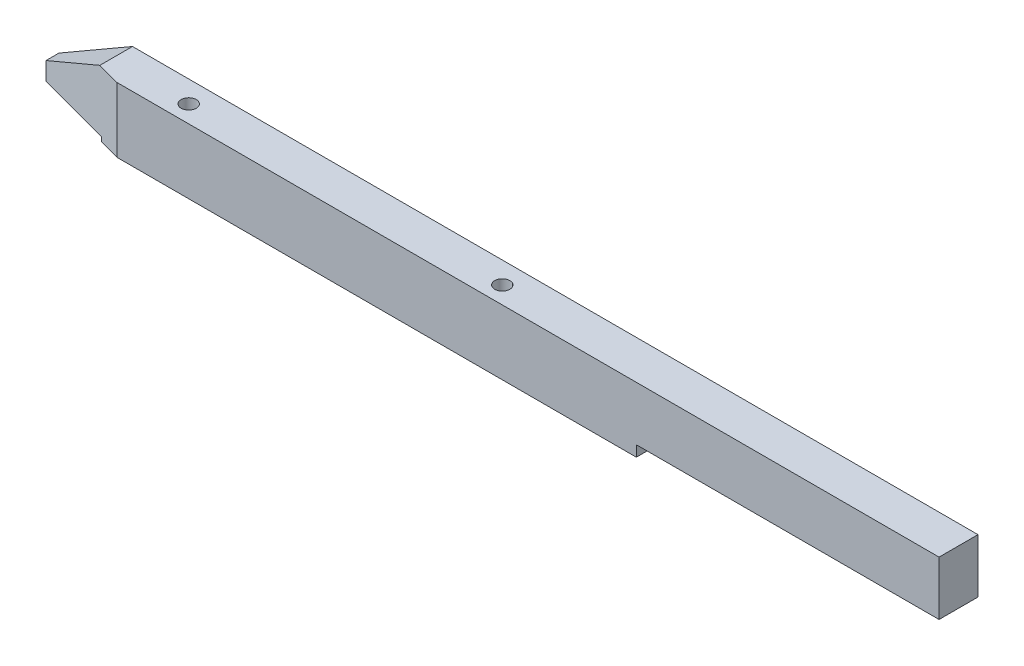
ISO-10303-21;
HEADER;
FILE_DESCRIPTION(('STEP AP214'),'2;1');
FILE_NAME('part.step','',(''),(''),'','','');
FILE_SCHEMA(('AUTOMOTIVE_DESIGN { 1 0 10303 214 1 1 1 1 }'));
ENDSEC;
DATA;
#1=APPLICATION_CONTEXT('core data for automotive mechanical design processes');
#2=APPLICATION_PROTOCOL_DEFINITION('international standard','automotive_design',2000,#1);
#3=PRODUCT_CONTEXT('',#1,'mechanical');
#4=PRODUCT('Part','Part','',(#3));
#5=PRODUCT_RELATED_PRODUCT_CATEGORY('part','',(#4));
#6=PRODUCT_DEFINITION_FORMATION('','',#4);
#7=PRODUCT_DEFINITION_CONTEXT('part definition',#1,'design');
#8=PRODUCT_DEFINITION('design','',#6,#7);
#9=PRODUCT_DEFINITION_SHAPE('','',#8);
#10=(LENGTH_UNIT() NAMED_UNIT(*) SI_UNIT(.MILLI.,.METRE.));
#11=(NAMED_UNIT(*) PLANE_ANGLE_UNIT() SI_UNIT($,.RADIAN.));
#12=(NAMED_UNIT(*) SI_UNIT($,.STERADIAN.) SOLID_ANGLE_UNIT());
#13=UNCERTAINTY_MEASURE_WITH_UNIT(LENGTH_MEASURE(1.E-05),#10,'distance_accuracy_value','');
#14=(GEOMETRIC_REPRESENTATION_CONTEXT(3) GLOBAL_UNCERTAINTY_ASSIGNED_CONTEXT((#13)) GLOBAL_UNIT_ASSIGNED_CONTEXT((#10,
#11,#12)) REPRESENTATION_CONTEXT('',''));
#15=CARTESIAN_POINT('',(0.,0.,0.));
#16=DIRECTION('',(0.,0.,1.));
#17=DIRECTION('',(1.,0.,0.));
#18=AXIS2_PLACEMENT_3D('',#15,#16,#17);
#19=CARTESIAN_POINT('',(212.5,15.,-9.));
#20=DIRECTION('',(0.,0.,1.));
#21=DIRECTION('',(0.,-1.,0.));
#22=AXIS2_PLACEMENT_3D('',#19,#20,#21);
#23=PLANE('',#22);
#24=DIRECTION('',(0.,1.,0.));
#25=VECTOR('',#24,1.);
#26=CARTESIAN_POINT('',(-212.5,15.,-9.));
#27=LINE('',#26,#25);
#28=CARTESIAN_POINT('',(-212.5,-13.,-9.));
#29=VERTEX_POINT('',#28);
#30=CARTESIAN_POINT('',(-212.5,-4.62990915244702,-9.));
#31=VERTEX_POINT('',#30);
#32=EDGE_CURVE('E123',#29,#31,#27,.T.);
#33=ORIENTED_EDGE('',*,*,#32,.T.);
#34=DIRECTION('',(0.866025403784442,0.499999999999995,0.));
#35=VECTOR('',#34,1.);
#36=CARTESIAN_POINT('',(-212.5,-4.62990915244702,-9.));
#37=LINE('',#36,#35);
#38=CARTESIAN_POINT('',(-178.5,15.,-9.));
#39=VERTEX_POINT('',#38);
#40=EDGE_CURVE('E111',#31,#39,#37,.T.);
#41=ORIENTED_EDGE('',*,*,#40,.T.);
#42=DIRECTION('',(-1.,0.,0.));
#43=VECTOR('',#42,1.);
#44=CARTESIAN_POINT('',(212.5,15.,-9.));
#45=LINE('',#44,#43);
#46=CARTESIAN_POINT('',(212.5,15.,-9.));
#47=VERTEX_POINT('',#46);
#48=EDGE_CURVE('E120',#47,#39,#45,.T.);
#49=ORIENTED_EDGE('',*,*,#48,.F.);
#50=DIRECTION('',(0.,1.,0.));
#51=VECTOR('',#50,1.);
#52=CARTESIAN_POINT('',(212.5,15.,-9.));
#53=LINE('',#52,#51);
#54=CARTESIAN_POINT('',(212.5,-10.,-9.));
#55=VERTEX_POINT('',#54);
#56=EDGE_CURVE('E179',#55,#47,#53,.T.);
#57=ORIENTED_EDGE('',*,*,#56,.F.);
#58=DIRECTION('',(-1.,0.,0.));
#59=VECTOR('',#58,1.);
#60=CARTESIAN_POINT('',(212.5,-10.,-9.));
#61=LINE('',#60,#59);
#62=CARTESIAN_POINT('',(72.5,-10.,-9.));
#63=VERTEX_POINT('',#62);
#64=EDGE_CURVE('E200',#55,#63,#61,.T.);
#65=ORIENTED_EDGE('',*,*,#64,.T.);
#66=DIRECTION('',(0.,-1.,0.));
#67=VECTOR('',#66,1.);
#68=CARTESIAN_POINT('',(72.5,-15.,-9.));
#69=LINE('',#68,#67);
#70=CARTESIAN_POINT('',(72.5,-15.,-9.));
#71=VERTEX_POINT('',#70);
#72=EDGE_CURVE('E203',#63,#71,#69,.T.);
#73=ORIENTED_EDGE('',*,*,#72,.T.);
#74=DIRECTION('',(-1.,0.,0.));
#75=VECTOR('',#74,1.);
#76=CARTESIAN_POINT('',(212.5,-15.,-9.));
#77=LINE('',#76,#75);
#78=CARTESIAN_POINT('',(-177.5,-15.,-9.));
#79=VERTEX_POINT('',#78);
#80=EDGE_CURVE('E175',#71,#79,#77,.T.);
#81=ORIENTED_EDGE('',*,*,#80,.T.);
#82=DIRECTION('',(0.,1.,0.));
#83=VECTOR('',#82,1.);
#84=CARTESIAN_POINT('',(-177.5,-13.,-9.));
#85=LINE('',#84,#83);
#86=CARTESIAN_POINT('',(-177.5,-13.,-9.));
#87=VERTEX_POINT('',#86);
#88=EDGE_CURVE('E191',#79,#87,#85,.T.);
#89=ORIENTED_EDGE('',*,*,#88,.T.);
#90=DIRECTION('',(-1.,0.,0.));
#91=VECTOR('',#90,1.);
#92=CARTESIAN_POINT('',(-212.5,-13.,-9.));
#93=LINE('',#92,#91);
#94=EDGE_CURVE('E193',#87,#29,#93,.T.);
#95=ORIENTED_EDGE('',*,*,#94,.T.);
#96=EDGE_LOOP('',(#33,#41,#49,#57,#65,#73,#81,#89,#95));
#97=FACE_BOUND('',#96,.T.);
#98=ADVANCED_FACE('F34',(#97),#23,.F.);
#99=CARTESIAN_POINT('',(212.5,15.,9.));
#100=DIRECTION('',(0.,-1.,0.));
#101=DIRECTION('',(0.,0.,-1.));
#102=AXIS2_PLACEMENT_3D('',#99,#100,#101);
#103=PLANE('',#102);
#104=CARTESIAN_POINT('',(-142.5,15.,1.));
#105=DIRECTION('',(0.,1.,0.));
#106=DIRECTION('',(0.,0.,1.));
#107=AXIS2_PLACEMENT_3D('',#104,#105,#106);
#108=CIRCLE('',#107,3.49999999999998);
#109=CARTESIAN_POINT('',(-142.5,15.,4.49999999999998));
#110=VERTEX_POINT('',#109);
#111=EDGE_CURVE('E210',#110,#110,#108,.T.);
#112=ORIENTED_EDGE('',*,*,#111,.F.);
#113=EDGE_LOOP('',(#112));
#114=FACE_BOUND('',#113,.T.);
#115=CARTESIAN_POINT('',(2.5,15.,1.));
#116=DIRECTION('',(0.,1.,0.));
#117=DIRECTION('',(0.,0.,1.));
#118=AXIS2_PLACEMENT_3D('',#115,#116,#117);
#119=CIRCLE('',#118,3.49999999999999);
#120=CARTESIAN_POINT('',(2.5,15.,4.49999999999999));
#121=VERTEX_POINT('',#120);
#122=EDGE_CURVE('E219',#121,#121,#119,.T.);
#123=ORIENTED_EDGE('',*,*,#122,.F.);
#124=EDGE_LOOP('',(#123));
#125=FACE_BOUND('',#124,.T.);
#126=ORIENTED_EDGE('',*,*,#48,.T.);
#127=DIRECTION('',(0.,0.,1.));
#128=VECTOR('',#127,1.);
#129=CARTESIAN_POINT('',(-178.5,15.,-9.));
#130=LINE('',#129,#128);
#131=CARTESIAN_POINT('',(-178.5,15.,6.11027254265818));
#132=VERTEX_POINT('',#131);
#133=EDGE_CURVE('E108',#39,#132,#130,.T.);
#134=ORIENTED_EDGE('',*,*,#133,.T.);
#135=DIRECTION('',(-0.965925826289068,0.,-0.258819045102522));
#136=VECTOR('',#135,1.);
#137=CARTESIAN_POINT('',(-167.715390309174,15.,9.));
#138=LINE('',#137,#136);
#139=CARTESIAN_POINT('',(-167.715390309174,15.,9.));
#140=VERTEX_POINT('',#139);
#141=EDGE_CURVE('E145',#132,#140,#138,.F.);
#142=ORIENTED_EDGE('',*,*,#141,.T.);
#143=DIRECTION('',(-1.,0.,0.));
#144=VECTOR('',#143,1.);
#145=CARTESIAN_POINT('',(212.5,15.,9.));
#146=LINE('',#145,#144);
#147=CARTESIAN_POINT('',(212.5,15.,9.));
#148=VERTEX_POINT('',#147);
#149=EDGE_CURVE('E130',#148,#140,#146,.T.);
#150=ORIENTED_EDGE('',*,*,#149,.F.);
#151=DIRECTION('',(0.,0.,1.));
#152=VECTOR('',#151,1.);
#153=CARTESIAN_POINT('',(212.5,15.,9.));
#154=LINE('',#153,#152);
#155=EDGE_CURVE('E128',#47,#148,#154,.T.);
#156=ORIENTED_EDGE('',*,*,#155,.F.);
#157=EDGE_LOOP('',(#126,#134,#142,#150,#156));
#158=FACE_BOUND('',#157,.T.);
#159=ADVANCED_FACE('F126',(#114,#125,#158),#103,.F.);
#160=CARTESIAN_POINT('',(212.5,15.,9.));
#161=DIRECTION('',(0.,0.,-1.));
#162=DIRECTION('',(0.,1.,0.));
#163=AXIS2_PLACEMENT_3D('',#160,#161,#162);
#164=PLANE('',#163);
#165=DIRECTION('',(-1.,0.,0.));
#166=VECTOR('',#165,1.);
#167=CARTESIAN_POINT('',(212.5,-15.,9.));
#168=LINE('',#167,#166);
#169=CARTESIAN_POINT('',(72.5,-15.,9.));
#170=VERTEX_POINT('',#169);
#171=CARTESIAN_POINT('',(-167.715390309174,-15.,9.));
#172=VERTEX_POINT('',#171);
#173=EDGE_CURVE('E136',#170,#172,#168,.T.);
#174=ORIENTED_EDGE('',*,*,#173,.F.);
#175=DIRECTION('',(0.,-1.,0.));
#176=VECTOR('',#175,1.);
#177=CARTESIAN_POINT('',(72.5,-15.,9.));
#178=LINE('',#177,#176);
#179=CARTESIAN_POINT('',(72.5,-10.,9.));
#180=VERTEX_POINT('',#179);
#181=EDGE_CURVE('E204',#180,#170,#178,.T.);
#182=ORIENTED_EDGE('',*,*,#181,.F.);
#183=DIRECTION('',(-1.,0.,0.));
#184=VECTOR('',#183,1.);
#185=CARTESIAN_POINT('',(212.5,-10.,9.));
#186=LINE('',#185,#184);
#187=CARTESIAN_POINT('',(212.5,-10.,9.));
#188=VERTEX_POINT('',#187);
#189=EDGE_CURVE('E160',#188,#180,#186,.T.);
#190=ORIENTED_EDGE('',*,*,#189,.F.);
#191=DIRECTION('',(0.,-1.,0.));
#192=VECTOR('',#191,1.);
#193=CARTESIAN_POINT('',(212.5,15.,9.));
#194=LINE('',#193,#192);
#195=EDGE_CURVE('E170',#148,#188,#194,.T.);
#196=ORIENTED_EDGE('',*,*,#195,.F.);
#197=ORIENTED_EDGE('',*,*,#149,.T.);
#198=DIRECTION('',(0.,-1.,0.));
#199=VECTOR('',#198,1.);
#200=CARTESIAN_POINT('',(-167.715390309174,15.,9.));
#201=LINE('',#200,#199);
#202=EDGE_CURVE('E129',#140,#172,#201,.T.);
#203=ORIENTED_EDGE('',*,*,#202,.T.);
#204=EDGE_LOOP('',(#174,#182,#190,#196,#197,#203));
#205=FACE_BOUND('',#204,.T.);
#206=ADVANCED_FACE('F167',(#205),#164,.F.);
#207=CARTESIAN_POINT('',(212.5,-15.,9.));
#208=DIRECTION('',(0.,1.,0.));
#209=DIRECTION('',(0.,0.,1.));
#210=AXIS2_PLACEMENT_3D('',#207,#208,#209);
#211=PLANE('',#210);
#212=CARTESIAN_POINT('',(-142.5,-15.,1.));
#213=DIRECTION('',(0.,1.,0.));
#214=DIRECTION('',(0.,0.,1.));
#215=AXIS2_PLACEMENT_3D('',#212,#213,#214);
#216=CIRCLE('',#215,3.5);
#217=CARTESIAN_POINT('',(-142.5,-15.,4.50000000000001));
#218=VERTEX_POINT('',#217);
#219=EDGE_CURVE('E216',#218,#218,#216,.T.);
#220=ORIENTED_EDGE('',*,*,#219,.T.);
#221=EDGE_LOOP('',(#220));
#222=FACE_BOUND('',#221,.T.);
#223=CARTESIAN_POINT('',(2.5,-15.,1.));
#224=DIRECTION('',(0.,1.,0.));
#225=DIRECTION('',(0.,0.,1.));
#226=AXIS2_PLACEMENT_3D('',#223,#224,#225);
#227=CIRCLE('',#226,3.49999999999999);
#228=CARTESIAN_POINT('',(2.5,-15.,4.5));
#229=VERTEX_POINT('',#228);
#230=EDGE_CURVE('E183',#229,#229,#227,.T.);
#231=ORIENTED_EDGE('',*,*,#230,.T.);
#232=EDGE_LOOP('',(#231));
#233=FACE_BOUND('',#232,.T.);
#234=DIRECTION('',(0.965925826289068,0.,0.258819045102522));
#235=VECTOR('',#234,1.);
#236=CARTESIAN_POINT('',(-167.715390309174,-15.,9.));
#237=LINE('',#236,#235);
#238=CARTESIAN_POINT('',(-177.5,-15.,6.37822173508931));
#239=VERTEX_POINT('',#238);
#240=EDGE_CURVE('E133',#172,#239,#237,.F.);
#241=ORIENTED_EDGE('',*,*,#240,.T.);
#242=DIRECTION('',(0.,0.,1.));
#243=VECTOR('',#242,1.);
#244=CARTESIAN_POINT('',(-177.5,-15.,-9.));
#245=LINE('',#244,#243);
#246=EDGE_CURVE('E56',#79,#239,#245,.T.);
#247=ORIENTED_EDGE('',*,*,#246,.F.);
#248=ORIENTED_EDGE('',*,*,#80,.F.);
#249=DIRECTION('',(0.,0.,1.));
#250=VECTOR('',#249,1.);
#251=CARTESIAN_POINT('',(72.5,-15.,-9.));
#252=LINE('',#251,#250);
#253=EDGE_CURVE('E188',#71,#170,#252,.T.);
#254=ORIENTED_EDGE('',*,*,#253,.T.);
#255=ORIENTED_EDGE('',*,*,#173,.T.);
#256=EDGE_LOOP('',(#241,#247,#248,#254,#255));
#257=FACE_BOUND('',#256,.T.);
#258=ADVANCED_FACE('F186',(#222,#233,#257),#211,.F.);
#259=CARTESIAN_POINT('',(212.5,0.,0.));
#260=DIRECTION('',(1.,0.,0.));
#261=DIRECTION('',(0.,0.,-1.));
#262=AXIS2_PLACEMENT_3D('',#259,#260,#261);
#263=PLANE('',#262);
#264=DIRECTION('',(0.,0.,1.));
#265=VECTOR('',#264,1.);
#266=CARTESIAN_POINT('',(212.5,-10.,-9.));
#267=LINE('',#266,#265);
#268=EDGE_CURVE('E206',#55,#188,#267,.T.);
#269=ORIENTED_EDGE('',*,*,#268,.F.);
#270=ORIENTED_EDGE('',*,*,#56,.T.);
#271=ORIENTED_EDGE('',*,*,#155,.T.);
#272=ORIENTED_EDGE('',*,*,#195,.T.);
#273=EDGE_LOOP('',(#269,#270,#271,#272));
#274=FACE_BOUND('',#273,.T.);
#275=ADVANCED_FACE('F223',(#274),#263,.T.);
#276=CARTESIAN_POINT('',(-212.5,0.,0.));
#277=DIRECTION('',(1.,0.,0.));
#278=DIRECTION('',(0.,0.,-1.));
#279=AXIS2_PLACEMENT_3D('',#276,#277,#278);
#280=PLANE('',#279);
#281=DIRECTION('',(0.,1.,0.));
#282=VECTOR('',#281,1.);
#283=CARTESIAN_POINT('',(-212.5,0.,-3.00000000000004));
#284=LINE('',#283,#282);
#285=CARTESIAN_POINT('',(-212.5,-13.,-3.00000000000004));
#286=VERTEX_POINT('',#285);
#287=CARTESIAN_POINT('',(-212.5,-4.62990915244701,-3.00000000000004));
#288=VERTEX_POINT('',#287);
#289=EDGE_CURVE('E142',#286,#288,#284,.T.);
#290=ORIENTED_EDGE('',*,*,#289,.T.);
#291=DIRECTION('',(0.,0.,1.));
#292=VECTOR('',#291,1.);
#293=CARTESIAN_POINT('',(-212.5,-4.62990915244702,-9.));
#294=LINE('',#293,#292);
#295=EDGE_CURVE('E48',#31,#288,#294,.T.);
#296=ORIENTED_EDGE('',*,*,#295,.F.);
#297=ORIENTED_EDGE('',*,*,#32,.F.);
#298=DIRECTION('',(0.,0.,1.));
#299=VECTOR('',#298,1.);
#300=CARTESIAN_POINT('',(-212.5,-13.,-9.));
#301=LINE('',#300,#299);
#302=EDGE_CURVE('E154',#29,#286,#301,.T.);
#303=ORIENTED_EDGE('',*,*,#302,.T.);
#304=EDGE_LOOP('',(#290,#296,#297,#303));
#305=FACE_BOUND('',#304,.T.);
#306=ADVANCED_FACE('F159',(#305),#280,.F.);
#307=CARTESIAN_POINT('',(-167.715390309174,15.,9.));
#308=DIRECTION('',(0.258819045102522,0.,-0.965925826289068));
#309=DIRECTION('',(0.,-1.,0.));
#310=AXIS2_PLACEMENT_3D('',#307,#308,#309);
#311=PLANE('',#310);
#312=DIRECTION('',(-0.843610022961953,-0.487058473848143,-0.226044624379458));
#313=VECTOR('',#312,1.);
#314=CARTESIAN_POINT('',(-170.273779663383,19.749410525759,8.31448163861525));
#315=LINE('',#314,#313);
#316=EDGE_CURVE('E11',#288,#132,#315,.F.);
#317=ORIENTED_EDGE('',*,*,#316,.F.);
#318=ORIENTED_EDGE('',*,*,#289,.F.);
#319=DIRECTION('',(0.965925826289068,0.,0.258819045102522));
#320=VECTOR('',#319,1.);
#321=CARTESIAN_POINT('',(-167.715390309174,-13.,9.));
#322=LINE('',#321,#320);
#323=CARTESIAN_POINT('',(-177.5,-13.,6.37822173508931));
#324=VERTEX_POINT('',#323);
#325=EDGE_CURVE('E42',#324,#286,#322,.F.);
#326=ORIENTED_EDGE('',*,*,#325,.F.);
#327=DIRECTION('',(0.,-1.,0.));
#328=VECTOR('',#327,1.);
#329=CARTESIAN_POINT('',(-177.5,15.,6.37822173508931));
#330=LINE('',#329,#328);
#331=EDGE_CURVE('E147',#239,#324,#330,.F.);
#332=ORIENTED_EDGE('',*,*,#331,.F.);
#333=ORIENTED_EDGE('',*,*,#240,.F.);
#334=ORIENTED_EDGE('',*,*,#202,.F.);
#335=ORIENTED_EDGE('',*,*,#141,.F.);
#336=EDGE_LOOP('',(#317,#318,#326,#332,#333,#334,#335));
#337=FACE_BOUND('',#336,.T.);
#338=ADVANCED_FACE('F36',(#337),#311,.F.);
#339=CARTESIAN_POINT('',(2.5,15.,1.));
#340=DIRECTION('',(0.,1.,0.));
#341=DIRECTION('',(0.,0.,1.));
#342=AXIS2_PLACEMENT_3D('',#339,#340,#341);
#343=CYLINDRICAL_SURFACE('',#342,3.49999999999999);
#344=ORIENTED_EDGE('',*,*,#230,.F.);
#345=EDGE_LOOP('',(#344));
#346=FACE_BOUND('',#345,.T.);
#347=ORIENTED_EDGE('',*,*,#122,.T.);
#348=EDGE_LOOP('',(#347));
#349=FACE_BOUND('',#348,.T.);
#350=ADVANCED_FACE('F237',(#346,#349),#343,.F.);
#351=CARTESIAN_POINT('',(-142.5,15.,1.));
#352=DIRECTION('',(0.,1.,0.));
#353=DIRECTION('',(0.,0.,1.));
#354=AXIS2_PLACEMENT_3D('',#351,#352,#353);
#355=CYLINDRICAL_SURFACE('',#354,3.49999999999999);
#356=ORIENTED_EDGE('',*,*,#219,.F.);
#357=EDGE_LOOP('',(#356));
#358=FACE_BOUND('',#357,.T.);
#359=ORIENTED_EDGE('',*,*,#111,.T.);
#360=EDGE_LOOP('',(#359));
#361=FACE_BOUND('',#360,.T.);
#362=ADVANCED_FACE('F230',(#358,#361),#355,.F.);
#363=CARTESIAN_POINT('',(72.5,-15.,-9.));
#364=DIRECTION('',(-1.,0.,0.));
#365=DIRECTION('',(0.,0.,1.));
#366=AXIS2_PLACEMENT_3D('',#363,#364,#365);
#367=PLANE('',#366);
#368=ORIENTED_EDGE('',*,*,#181,.T.);
#369=ORIENTED_EDGE('',*,*,#253,.F.);
#370=ORIENTED_EDGE('',*,*,#72,.F.);
#371=DIRECTION('',(0.,0.,1.));
#372=VECTOR('',#371,1.);
#373=CARTESIAN_POINT('',(72.5,-10.,-9.));
#374=LINE('',#373,#372);
#375=EDGE_CURVE('E211',#63,#180,#374,.T.);
#376=ORIENTED_EDGE('',*,*,#375,.T.);
#377=EDGE_LOOP('',(#368,#369,#370,#376));
#378=FACE_BOUND('',#377,.T.);
#379=ADVANCED_FACE('F228',(#378),#367,.F.);
#380=CARTESIAN_POINT('',(212.5,-10.,-9.));
#381=DIRECTION('',(0.,1.,0.));
#382=DIRECTION('',(-1.,0.,0.));
#383=AXIS2_PLACEMENT_3D('',#380,#381,#382);
#384=PLANE('',#383);
#385=ORIENTED_EDGE('',*,*,#189,.T.);
#386=ORIENTED_EDGE('',*,*,#375,.F.);
#387=ORIENTED_EDGE('',*,*,#64,.F.);
#388=ORIENTED_EDGE('',*,*,#268,.T.);
#389=EDGE_LOOP('',(#385,#386,#387,#388));
#390=FACE_BOUND('',#389,.T.);
#391=ADVANCED_FACE('F226',(#390),#384,.F.);
#392=CARTESIAN_POINT('',(-212.5,-13.,-9.));
#393=DIRECTION('',(0.,1.,0.));
#394=DIRECTION('',(-1.,0.,0.));
#395=AXIS2_PLACEMENT_3D('',#392,#393,#394);
#396=PLANE('',#395);
#397=ORIENTED_EDGE('',*,*,#325,.T.);
#398=ORIENTED_EDGE('',*,*,#302,.F.);
#399=ORIENTED_EDGE('',*,*,#94,.F.);
#400=DIRECTION('',(0.,0.,1.));
#401=VECTOR('',#400,1.);
#402=CARTESIAN_POINT('',(-177.5,-13.,-9.));
#403=LINE('',#402,#401);
#404=EDGE_CURVE('E155',#87,#324,#403,.T.);
#405=ORIENTED_EDGE('',*,*,#404,.T.);
#406=EDGE_LOOP('',(#397,#398,#399,#405));
#407=FACE_BOUND('',#406,.T.);
#408=ADVANCED_FACE('F152',(#407),#396,.F.);
#409=CARTESIAN_POINT('',(-177.5,-13.,-9.));
#410=DIRECTION('',(1.,0.,0.));
#411=DIRECTION('',(0.,0.,-1.));
#412=AXIS2_PLACEMENT_3D('',#409,#410,#411);
#413=PLANE('',#412);
#414=ORIENTED_EDGE('',*,*,#331,.T.);
#415=ORIENTED_EDGE('',*,*,#404,.F.);
#416=ORIENTED_EDGE('',*,*,#88,.F.);
#417=ORIENTED_EDGE('',*,*,#246,.T.);
#418=EDGE_LOOP('',(#414,#415,#416,#417));
#419=FACE_BOUND('',#418,.T.);
#420=ADVANCED_FACE('F189',(#419),#413,.F.);
#421=CARTESIAN_POINT('',(-212.5,-4.62990915244702,-9.));
#422=DIRECTION('',(0.499999999999995,-0.866025403784442,0.));
#423=DIRECTION('',(0.866025403784442,0.499999999999995,0.));
#424=AXIS2_PLACEMENT_3D('',#421,#422,#423);
#425=PLANE('',#424);
#426=ORIENTED_EDGE('',*,*,#316,.T.);
#427=ORIENTED_EDGE('',*,*,#133,.F.);
#428=ORIENTED_EDGE('',*,*,#40,.F.);
#429=ORIENTED_EDGE('',*,*,#295,.T.);
#430=EDGE_LOOP('',(#426,#427,#428,#429));
#431=FACE_BOUND('',#430,.T.);
#432=ADVANCED_FACE('F110',(#431),#425,.F.);
#433=CLOSED_SHELL('',(#98,#159,#206,#258,#275,#306,#338,#350,#362,#379,#391,#408,#420,#432));
#434=MANIFOLD_SOLID_BREP('B2',#433);
#435=ADVANCED_BREP_SHAPE_REPRESENTATION('',(#18,#434),#14);
#436=SHAPE_DEFINITION_REPRESENTATION(#9,#435);
ENDSEC;
END-ISO-10303-21;
